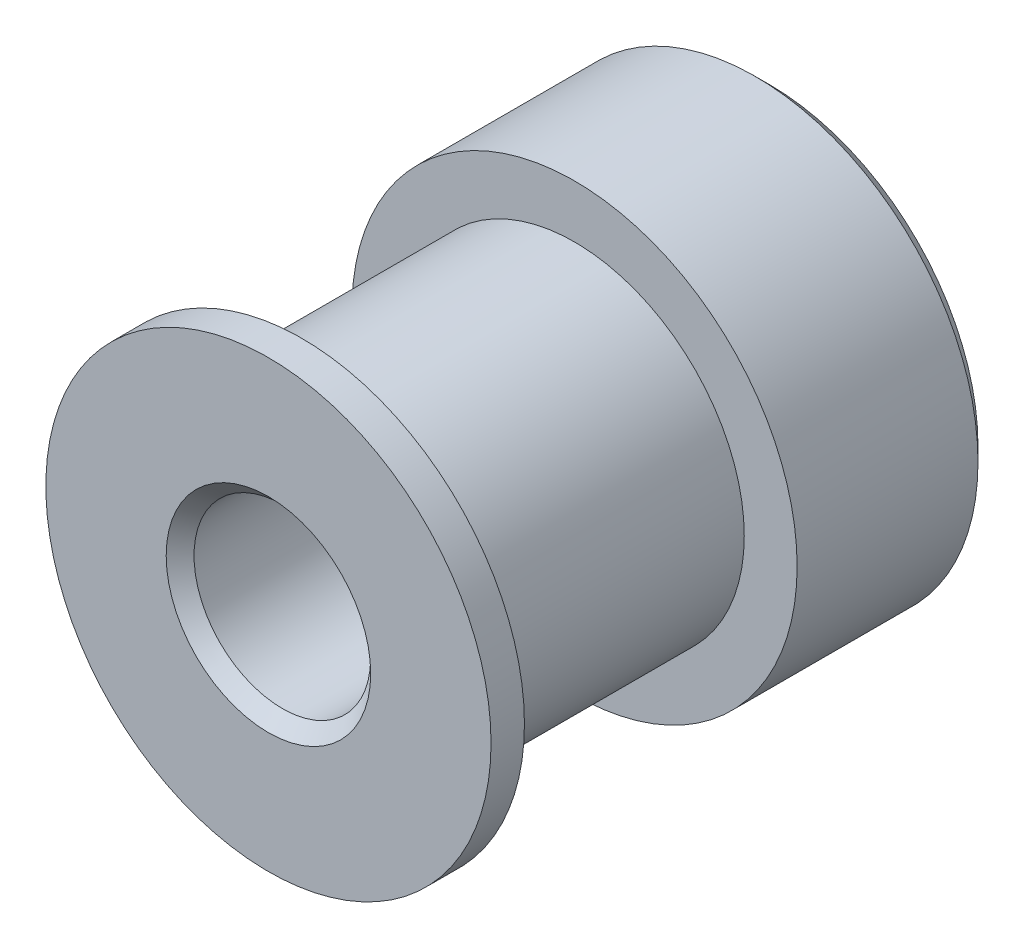
ISO-10303-21;
HEADER;
FILE_DESCRIPTION(('STEP AP214'),'2;1');
FILE_NAME('part.step','',(''),(''),'','','');
FILE_SCHEMA(('AUTOMOTIVE_DESIGN { 1 0 10303 214 1 1 1 1 }'));
ENDSEC;
DATA;
#1=APPLICATION_CONTEXT('core data for automotive mechanical design processes');
#2=APPLICATION_PROTOCOL_DEFINITION('international standard','automotive_design',2000,#1);
#3=PRODUCT_CONTEXT('',#1,'mechanical');
#4=PRODUCT('Part','Part','',(#3));
#5=PRODUCT_RELATED_PRODUCT_CATEGORY('part','',(#4));
#6=PRODUCT_DEFINITION_FORMATION('','',#4);
#7=PRODUCT_DEFINITION_CONTEXT('part definition',#1,'design');
#8=PRODUCT_DEFINITION('design','',#6,#7);
#9=PRODUCT_DEFINITION_SHAPE('','',#8);
#10=(LENGTH_UNIT() NAMED_UNIT(*) SI_UNIT(.MILLI.,.METRE.));
#11=(NAMED_UNIT(*) PLANE_ANGLE_UNIT() SI_UNIT($,.RADIAN.));
#12=(NAMED_UNIT(*) SI_UNIT($,.STERADIAN.) SOLID_ANGLE_UNIT());
#13=UNCERTAINTY_MEASURE_WITH_UNIT(LENGTH_MEASURE(1.E-05),#10,'distance_accuracy_value','');
#14=(GEOMETRIC_REPRESENTATION_CONTEXT(3) GLOBAL_UNCERTAINTY_ASSIGNED_CONTEXT((#13)) GLOBAL_UNIT_ASSIGNED_CONTEXT((#10,
#11,#12)) REPRESENTATION_CONTEXT('',''));
#15=CARTESIAN_POINT('',(0.,0.,0.));
#16=DIRECTION('',(0.,0.,1.));
#17=DIRECTION('',(1.,0.,0.));
#18=AXIS2_PLACEMENT_3D('',#15,#16,#17);
#19=CARTESIAN_POINT('',(0.,0.,7.));
#20=DIRECTION('',(0.,0.,1.));
#21=DIRECTION('',(1.,0.,0.));
#22=AXIS2_PLACEMENT_3D('',#19,#20,#21);
#23=PLANE('',#22);
#24=CARTESIAN_POINT('',(0.,0.,7.));
#25=DIRECTION('',(0.,0.,1.));
#26=DIRECTION('',(1.,0.,0.));
#27=AXIS2_PLACEMENT_3D('',#24,#25,#26);
#28=CIRCLE('',#27,8.);
#29=CARTESIAN_POINT('',(8.,0.,7.));
#30=VERTEX_POINT('',#29);
#31=EDGE_CURVE('E140',#30,#30,#28,.T.);
#32=ORIENTED_EDGE('',*,*,#31,.T.);
#33=EDGE_LOOP('',(#32));
#34=FACE_BOUND('',#33,.T.);
#35=CARTESIAN_POINT('',(0.,0.,7.));
#36=DIRECTION('',(0.,0.,1.));
#37=DIRECTION('',(1.,0.,0.));
#38=AXIS2_PLACEMENT_3D('',#35,#36,#37);
#39=CIRCLE('',#38,6.1);
#40=CARTESIAN_POINT('',(6.1,0.,7.));
#41=VERTEX_POINT('',#40);
#42=EDGE_CURVE('E131',#41,#41,#39,.T.);
#43=ORIENTED_EDGE('',*,*,#42,.F.);
#44=EDGE_LOOP('',(#43));
#45=FACE_BOUND('',#44,.T.);
#46=ADVANCED_FACE('F31',(#34,#45),#23,.T.);
#47=CARTESIAN_POINT('',(0.,0.,7.));
#48=DIRECTION('',(0.,0.,-1.));
#49=DIRECTION('',(-1.,0.,0.));
#50=AXIS2_PLACEMENT_3D('',#47,#48,#49);
#51=CYLINDRICAL_SURFACE('',#50,8.);
#52=CARTESIAN_POINT('',(0.,-8.,5.));
#53=CARTESIAN_POINT('',(0.0834717464654712,-7.99999848833852,4.99999681041172));
#54=CARTESIAN_POINT('',(0.166984992730099,-7.99868009921714,4.99300892338062));
#55=CARTESIAN_POINT('',(0.331658129841798,-7.9935478589052,4.96526000488165));
#56=CARTESIAN_POINT('',(0.412815974152226,-7.98973190166897,4.94448734936027));
#57=CARTESIAN_POINT('',(0.570372961851801,-7.98003138765458,4.88982729874066));
#58=CARTESIAN_POINT('',(0.646776330685344,-7.97414869946483,4.85595174754746));
#59=CARTESIAN_POINT('',(0.792807973094006,-7.96095710599783,4.77608112307718));
#60=CARTESIAN_POINT('',(0.862436794477323,-7.9536483161829,4.73008703085518));
#61=CARTESIAN_POINT('',(0.993783715930503,-7.93831336430504,4.62670023199632));
#62=CARTESIAN_POINT('',(1.05540895503183,-7.93028034856351,4.56919055532986));
#63=CARTESIAN_POINT('',(1.16819606135369,-7.9144531845865,4.44465669091244));
#64=CARTESIAN_POINT('',(1.21935717689242,-7.90665905354527,4.37763182023071));
#65=CARTESIAN_POINT('',(1.31014998665793,-7.89212551245005,4.23531391163603));
#66=CARTESIAN_POINT('',(1.34968721969605,-7.88539493886182,4.15995962968276));
#67=CARTESIAN_POINT('',(1.41550524332283,-7.87384713211987,4.00353108482321));
#68=CARTESIAN_POINT('',(1.44178717713098,-7.86902973396962,3.92245731588878));
#69=CARTESIAN_POINT('',(1.480050535035,-7.8619226957455,3.75788476908559));
#70=CARTESIAN_POINT('',(1.49219390192039,-7.85960445366405,3.67442490279654));
#71=CARTESIAN_POINT('',(1.50233808095346,-7.85767197152761,3.50662261519175));
#72=CARTESIAN_POINT('',(1.50034016135374,-7.8580574889876,3.4222802736977));
#73=CARTESIAN_POINT('',(1.48238979602362,-7.86146292701753,3.25628047473395));
#74=CARTESIAN_POINT('',(1.46662149996045,-7.86444808147334,3.17460228569985));
#75=CARTESIAN_POINT('',(1.42186799396207,-7.87266183284666,3.01507158021739));
#76=CARTESIAN_POINT('',(1.39288222239499,-7.87789052509516,2.9372192264907));
#77=CARTESIAN_POINT('',(1.322336471793,-7.89003855292589,2.78701132099974));
#78=CARTESIAN_POINT('',(1.28070213532456,-7.89696783823366,2.71469152941919));
#79=CARTESIAN_POINT('',(1.18609368930416,-7.91172971602918,2.57799527145977));
#80=CARTESIAN_POINT('',(1.13311842889266,-7.91956240015522,2.5136196122852));
#81=CARTESIAN_POINT('',(1.01633905685298,-7.93540001272164,2.39357504432754));
#82=CARTESIAN_POINT('',(0.952377436860683,-7.94340571024031,2.33805934754826));
#83=CARTESIAN_POINT('',(0.815968037098827,-7.95857386108318,2.2385227593246));
#84=CARTESIAN_POINT('',(0.74352017225577,-7.96573630595245,2.19450198312958));
#85=CARTESIAN_POINT('',(0.592034988874669,-7.97842539677509,2.11918224612998));
#86=CARTESIAN_POINT('',(0.512989564446494,-7.98394999136289,2.08789922088211));
#87=CARTESIAN_POINT('',(0.350639115398697,-7.99272505402719,2.03909790690784));
#88=CARTESIAN_POINT('',(0.267334544277787,-7.99597576367994,2.02157815595464));
#89=CARTESIAN_POINT('',(0.100148652903385,-7.99980360641981,2.00101396898173));
#90=CARTESIAN_POINT('',(0.0162940126341354,-8.00041950912279,1.99775960847027));
#91=CARTESIAN_POINT('',(-0.150761248092184,-7.99901543598228,2.00525547954765));
#92=CARTESIAN_POINT('',(-0.233961900480385,-7.99699558964431,2.01600502306526));
#93=CARTESIAN_POINT('',(-0.396681573218216,-7.99057111500406,2.05102903518337));
#94=CARTESIAN_POINT('',(-0.476224261046062,-7.98618522374031,2.07519728253781));
#95=CARTESIAN_POINT('',(-0.630128631824632,-7.97551842212498,2.13625770677879));
#96=CARTESIAN_POINT('',(-0.704489962595102,-7.96923738311334,2.17315074756579));
#97=CARTESIAN_POINT('',(-0.846816671513213,-7.95538030357666,2.25907812815951));
#98=CARTESIAN_POINT('',(-0.91470327701512,-7.94779086174563,2.30824073853684));
#99=CARTESIAN_POINT('',(-1.04133832326454,-7.93219343489712,2.41713813736236));
#100=CARTESIAN_POINT('',(-1.10008590976087,-7.92418541084687,2.47687391300133));
#101=CARTESIAN_POINT('',(-1.20757295872048,-7.9085247569745,2.60617231891143));
#102=CARTESIAN_POINT('',(-1.25616916218577,-7.90087825860257,2.67585490812539));
#103=CARTESIAN_POINT('',(-1.34096675057787,-7.88692985578532,2.82251762452375));
#104=CARTESIAN_POINT('',(-1.37716859613924,-7.8806279013735,2.89949748037047));
#105=CARTESIAN_POINT('',(-1.43594673512823,-7.87013024209574,3.05820586724254));
#106=CARTESIAN_POINT('',(-1.45858868794786,-7.86592440436878,3.13990937955933));
#107=CARTESIAN_POINT('',(-1.48980679326235,-7.86007203802415,3.3060472225214));
#108=CARTESIAN_POINT('',(-1.49838453270708,-7.8584252206579,3.3904812439704));
#109=CARTESIAN_POINT('',(-1.50117762148355,-7.85789199803857,3.55824833144151));
#110=CARTESIAN_POINT('',(-1.49561895003499,-7.85896215974293,3.641577580957));
#111=CARTESIAN_POINT('',(-1.47079175378803,-7.86364600659998,3.80609142204529));
#112=CARTESIAN_POINT('',(-1.45152331089332,-7.86725967655747,3.88727602642744));
#113=CARTESIAN_POINT('',(-1.39991887583263,-7.8766050802318,4.04507448479548));
#114=CARTESIAN_POINT('',(-1.36760735397252,-7.88233284594965,4.12169659134577));
#115=CARTESIAN_POINT('',(-1.29085868912204,-7.8952638755184,4.26846825424084));
#116=CARTESIAN_POINT('',(-1.24642068948186,-7.90246724360119,4.33861735284478));
#117=CARTESIAN_POINT('',(-1.14589487339535,-7.91767266107745,4.47158368004229));
#118=CARTESIAN_POINT('',(-1.08964259864303,-7.92568505353043,4.5342754125671));
#119=CARTESIAN_POINT('',(-0.967427926742291,-7.94152833918735,4.64940516246452));
#120=CARTESIAN_POINT('',(-0.901463301891616,-7.94935919027328,4.70184082098014));
#121=CARTESIAN_POINT('',(-0.760984945071873,-7.96403975968049,4.79541095262706));
#122=CARTESIAN_POINT('',(-0.686399590640517,-7.97088000990561,4.83643942849064));
#123=CARTESIAN_POINT('',(-0.531290113653834,-7.98271619380687,4.90531763660513));
#124=CARTESIAN_POINT('',(-0.450771651705248,-7.98771385879037,4.93317974704691));
#125=CARTESIAN_POINT('',(-0.308347202825154,-7.99428290707632,4.96927731441867));
#126=CARTESIAN_POINT('',(-0.24727381025187,-7.99641470878206,4.9807786303128));
#127=CARTESIAN_POINT('',(-0.124141247115157,-7.9992737995401,4.99614106211645));
#128=CARTESIAN_POINT('',(-0.0620821016527089,-8.00000112429805,5.00000237225591));
#129=CARTESIAN_POINT('',(0.,-8.,5.));
#130=B_SPLINE_CURVE_WITH_KNOTS('',3,(#52,#53,#54,#55,#56,#57,#58,#59,#60,#61,#62,#63,#64,#65,
#66,#67,#68,#69,#70,#71,#72,#73,#74,#75,#76,#77,#78,#79,#80,#81,#82,#83,#84,#85,#86,#87,#88,#89,
#90,#91,#92,#93,#94,#95,#96,#97,#98,#99,#100,#101,#102,#103,#104,#105,#106,#107,#108,#109,#110,
#111,#112,#113,#114,#115,#116,#117,#118,#119,#120,#121,#122,#123,#124,#125,#126,#127,#128,#129),
.UNSPECIFIED.,.T.,.F.,(4,2,2,2,2,2,2,2,2,2,2,2,2,2,2,2,2,2,2,2,2,2,2,2,2,2,2,2,2,2,2,2,2,2,2,2,
2,2,4),(0.,0.250188200964924,0.500587642535452,0.750761271230907,1.00091465336891,
1.2537511801363,1.50660586283617,1.76146190504358,2.01629596311948,2.26818151445336,
2.52004447587256,2.76859000612766,3.01714609846787,3.26719262629531,3.51726454049859,
3.77127768464077,4.02529337544948,4.27962588321699,4.53393136673745,4.78448174076097,
5.03501980464583,5.28360233907828,5.53220175338032,5.78351778017708,6.03485728413098,
6.28953436987299,6.54420198954945,6.79762627818559,7.05102196946513,7.30039252231748,
7.54976158541507,7.79866496207692,8.04758592655423,8.3002336996638,8.55293951262255,
8.80792048916314,9.06266126931173,9.24874344524409,9.4348208903954),.UNSPECIFIED.);
#131=CARTESIAN_POINT('',(0.,-8.,5.));
#132=VERTEX_POINT('',#131);
#133=EDGE_CURVE('E57',#132,#132,#130,.T.);
#134=ORIENTED_EDGE('',*,*,#133,.T.);
#135=EDGE_LOOP('',(#134));
#136=FACE_BOUND('',#135,.T.);
#137=CARTESIAN_POINT('',(-8.,0.,2.));
#138=CARTESIAN_POINT('',(-7.99999848833852,0.0834717464654704,2.00000318958828));
#139=CARTESIAN_POINT('',(-7.99868009921714,0.166984992730098,2.00699107661938));
#140=CARTESIAN_POINT('',(-7.9935478589052,0.331658129841797,2.03473999511835));
#141=CARTESIAN_POINT('',(-7.98973190166897,0.412815974152225,2.05551265063973));
#142=CARTESIAN_POINT('',(-7.98003138765458,0.570372961851801,2.11017270125934));
#143=CARTESIAN_POINT('',(-7.97414869946483,0.646776330685343,2.14404825245254));
#144=CARTESIAN_POINT('',(-7.96095710599783,0.792807973094006,2.22391887692282));
#145=CARTESIAN_POINT('',(-7.9536483161829,0.862436794477322,2.26991296914482));
#146=CARTESIAN_POINT('',(-7.93831336430504,0.993783715930502,2.37329976800368));
#147=CARTESIAN_POINT('',(-7.93028034856351,1.05540895503183,2.43080944467014));
#148=CARTESIAN_POINT('',(-7.9144531845865,1.16819606135369,2.55534330908756));
#149=CARTESIAN_POINT('',(-7.90665905354527,1.21935717689241,2.62236817976929));
#150=CARTESIAN_POINT('',(-7.89212551245005,1.31014998665793,2.76468608836397));
#151=CARTESIAN_POINT('',(-7.88539493886182,1.34968721969605,2.84004037031724));
#152=CARTESIAN_POINT('',(-7.87384713211987,1.41550524332283,2.99646891517679));
#153=CARTESIAN_POINT('',(-7.86902973396962,1.44178717713098,3.07754268411122));
#154=CARTESIAN_POINT('',(-7.8619226957455,1.480050535035,3.24211523091441));
#155=CARTESIAN_POINT('',(-7.85960445366405,1.49219390192039,3.32557509720346));
#156=CARTESIAN_POINT('',(-7.85767197152761,1.50233808095346,3.49337738480825));
#157=CARTESIAN_POINT('',(-7.8580574889876,1.50034016135374,3.5777197263023));
#158=CARTESIAN_POINT('',(-7.86146292701753,1.48238979602362,3.74371952526605));
#159=CARTESIAN_POINT('',(-7.86444808147334,1.46662149996045,3.82539771430015));
#160=CARTESIAN_POINT('',(-7.87266183284666,1.42186799396207,3.98492841978261));
#161=CARTESIAN_POINT('',(-7.87789052509516,1.39288222239499,4.0627807735093));
#162=CARTESIAN_POINT('',(-7.89003855292589,1.322336471793,4.21298867900026));
#163=CARTESIAN_POINT('',(-7.89696783823366,1.28070213532456,4.28530847058081));
#164=CARTESIAN_POINT('',(-7.91172971602918,1.18609368930416,4.42200472854023));
#165=CARTESIAN_POINT('',(-7.91956240015522,1.13311842889266,4.4863803877148));
#166=CARTESIAN_POINT('',(-7.93540001272164,1.01633905685298,4.60642495567246));
#167=CARTESIAN_POINT('',(-7.9434057102403,0.952377436860682,4.66194065245174));
#168=CARTESIAN_POINT('',(-7.95857386108318,0.815968037098826,4.76147724067541));
#169=CARTESIAN_POINT('',(-7.96573630595245,0.743520172255769,4.80549801687042));
#170=CARTESIAN_POINT('',(-7.97842539677509,0.592034988874667,4.88081775387002));
#171=CARTESIAN_POINT('',(-7.98394999136289,0.512989564446493,4.9121007791179));
#172=CARTESIAN_POINT('',(-7.99272505402719,0.350639115398696,4.96090209309216));
#173=CARTESIAN_POINT('',(-7.99597576367994,0.267334544277786,4.97842184404536));
#174=CARTESIAN_POINT('',(-7.99980360641981,0.100148652903385,4.99898603101827));
#175=CARTESIAN_POINT('',(-8.00041950912279,0.0162940126341347,5.00224039152973));
#176=CARTESIAN_POINT('',(-7.99901543598228,-0.150761248092184,4.99474452045235));
#177=CARTESIAN_POINT('',(-7.99699558964431,-0.233961900480386,4.98399497693474));
#178=CARTESIAN_POINT('',(-7.99057111500406,-0.396681573218218,4.94897096481663));
#179=CARTESIAN_POINT('',(-7.98618522374031,-0.476224261046064,4.92480271746219));
#180=CARTESIAN_POINT('',(-7.97551842212498,-0.630128631824633,4.86374229322121));
#181=CARTESIAN_POINT('',(-7.96923738311334,-0.704489962595103,4.82684925243421));
#182=CARTESIAN_POINT('',(-7.95538030357666,-0.846816671513214,4.74092187184049));
#183=CARTESIAN_POINT('',(-7.94779086174563,-0.914703277015122,4.69175926146316));
#184=CARTESIAN_POINT('',(-7.93219343489712,-1.04133832326455,4.58286186263764));
#185=CARTESIAN_POINT('',(-7.92418541084687,-1.10008590976087,4.52312608699867));
#186=CARTESIAN_POINT('',(-7.9085247569745,-1.20757295872048,4.39382768108857));
#187=CARTESIAN_POINT('',(-7.90087825860257,-1.25616916218577,4.32414509187461));
#188=CARTESIAN_POINT('',(-7.88692985578532,-1.34096675057787,4.17748237547625));
#189=CARTESIAN_POINT('',(-7.8806279013735,-1.37716859613924,4.10050251962953));
#190=CARTESIAN_POINT('',(-7.87013024209574,-1.43594673512823,3.94179413275746));
#191=CARTESIAN_POINT('',(-7.86592440436878,-1.45858868794786,3.86009062044067));
#192=CARTESIAN_POINT('',(-7.86007203802415,-1.48980679326236,3.6939527774786));
#193=CARTESIAN_POINT('',(-7.8584252206579,-1.49838453270708,3.6095187560296));
#194=CARTESIAN_POINT('',(-7.85789199803857,-1.50117762148355,3.44175166855849));
#195=CARTESIAN_POINT('',(-7.85896215974293,-1.49561895003499,3.358422419043));
#196=CARTESIAN_POINT('',(-7.86364600659998,-1.47079175378803,3.19390857795471));
#197=CARTESIAN_POINT('',(-7.86725967655747,-1.45152331089332,3.11272397357256));
#198=CARTESIAN_POINT('',(-7.8766050802318,-1.39991887583263,2.95492551520452));
#199=CARTESIAN_POINT('',(-7.88233284594965,-1.36760735397252,2.87830340865423));
#200=CARTESIAN_POINT('',(-7.8952638755184,-1.29085868912204,2.73153174575916));
#201=CARTESIAN_POINT('',(-7.90246724360119,-1.24642068948186,2.66138264715522));
#202=CARTESIAN_POINT('',(-7.91767266107745,-1.14589487339535,2.52841631995771));
#203=CARTESIAN_POINT('',(-7.92568505353043,-1.08964259864304,2.4657245874329));
#204=CARTESIAN_POINT('',(-7.94152833918735,-0.967427926742291,2.35059483753548));
#205=CARTESIAN_POINT('',(-7.94935919027328,-0.901463301891616,2.29815917901986));
#206=CARTESIAN_POINT('',(-7.96403975968049,-0.760984945071873,2.20458904737294));
#207=CARTESIAN_POINT('',(-7.97088000990561,-0.686399590640517,2.16356057150936));
#208=CARTESIAN_POINT('',(-7.98271619380687,-0.531290113653835,2.09468236339487));
#209=CARTESIAN_POINT('',(-7.98771385879037,-0.450771651705249,2.06682025295309));
#210=CARTESIAN_POINT('',(-7.99428290707632,-0.308347202825155,2.03072268558133));
#211=CARTESIAN_POINT('',(-7.99641470878206,-0.247273810251872,2.0192213696872));
#212=CARTESIAN_POINT('',(-7.9992737995401,-0.124141247115159,2.00385893788355));
#213=CARTESIAN_POINT('',(-8.00000112429805,-0.0620821016527104,1.99999762774409));
#214=CARTESIAN_POINT('',(-8.,0.,2.));
#215=B_SPLINE_CURVE_WITH_KNOTS('',3,(#137,#138,#139,#140,#141,#142,#143,#144,#145,#146,#147,
#148,#149,#150,#151,#152,#153,#154,#155,#156,#157,#158,#159,#160,#161,#162,#163,#164,#165,#166,
#167,#168,#169,#170,#171,#172,#173,#174,#175,#176,#177,#178,#179,#180,#181,#182,#183,#184,#185,
#186,#187,#188,#189,#190,#191,#192,#193,#194,#195,#196,#197,#198,#199,#200,#201,#202,#203,#204,
#205,#206,#207,#208,#209,#210,#211,#212,#213,#214),.UNSPECIFIED.,.T.,.F.,(4,2,2,2,2,2,2,2,2,2,2,
2,2,2,2,2,2,2,2,2,2,2,2,2,2,2,2,2,2,2,2,2,2,2,2,2,2,2,4),(0.,0.250188200964924,
0.500587642535452,0.750761271230907,1.00091465336891,1.2537511801363,1.50660586283617,
1.76146190504357,2.01629596311948,2.26818151445336,2.52004447587256,2.76859000612765,
3.01714609846786,3.26719262629531,3.51726454049859,3.77127768464077,4.02529337544948,
4.27962588321699,4.53393136673745,4.78448174076097,5.03501980464584,5.28360233907828,
5.53220175338032,5.78351778017708,6.03485728413098,6.28953436987299,6.54420198954945,
6.79762627818559,7.05102196946513,7.30039252231748,7.54976158541507,7.79866496207693,
8.04758592655423,8.3002336996638,8.55293951262256,8.80792048916315,9.06266126931173,
9.24874344524409,9.43482089039541),.UNSPECIFIED.);
#216=CARTESIAN_POINT('',(-8.,0.,2.));
#217=VERTEX_POINT('',#216);
#218=EDGE_CURVE('E56',#217,#217,#215,.T.);
#219=ORIENTED_EDGE('',*,*,#218,.T.);
#220=EDGE_LOOP('',(#219));
#221=FACE_BOUND('',#220,.T.);
#222=CARTESIAN_POINT('',(0.,0.,0.5));
#223=DIRECTION('',(0.,0.,1.));
#224=DIRECTION('',(1.,0.,0.));
#225=AXIS2_PLACEMENT_3D('',#222,#223,#224);
#226=CIRCLE('',#225,8.);
#227=CARTESIAN_POINT('',(8.,0.,0.5));
#228=VERTEX_POINT('',#227);
#229=EDGE_CURVE('E143',#228,#228,#226,.T.);
#230=ORIENTED_EDGE('',*,*,#229,.T.);
#231=EDGE_LOOP('',(#230));
#232=FACE_BOUND('',#231,.T.);
#233=ORIENTED_EDGE('',*,*,#31,.F.);
#234=EDGE_LOOP('',(#233));
#235=FACE_BOUND('',#234,.T.);
#236=ADVANCED_FACE('F80',(#136,#221,#232,#235),#51,.T.);
#237=CARTESIAN_POINT('',(0.,0.,0.));
#238=DIRECTION('',(0.,0.,1.));
#239=DIRECTION('',(1.,0.,0.));
#240=AXIS2_PLACEMENT_3D('',#237,#238,#239);
#241=PLANE('',#240);
#242=CARTESIAN_POINT('',(0.,0.,0.));
#243=DIRECTION('',(0.,0.,1.));
#244=DIRECTION('',(1.,0.,0.));
#245=AXIS2_PLACEMENT_3D('',#242,#243,#244);
#246=CIRCLE('',#245,7.5);
#247=CARTESIAN_POINT('',(7.5,0.,0.));
#248=VERTEX_POINT('',#247);
#249=EDGE_CURVE('E149',#248,#248,#246,.F.);
#250=ORIENTED_EDGE('',*,*,#249,.T.);
#251=EDGE_LOOP('',(#250));
#252=FACE_BOUND('',#251,.T.);
#253=CARTESIAN_POINT('',(0.,0.,0.));
#254=DIRECTION('',(0.,0.,1.));
#255=DIRECTION('',(1.,0.,0.));
#256=AXIS2_PLACEMENT_3D('',#253,#254,#255);
#257=CIRCLE('',#256,3.675);
#258=CARTESIAN_POINT('',(3.675,0.,0.));
#259=VERTEX_POINT('',#258);
#260=EDGE_CURVE('E146',#259,#259,#257,.T.);
#261=ORIENTED_EDGE('',*,*,#260,.T.);
#262=EDGE_LOOP('',(#261));
#263=FACE_BOUND('',#262,.T.);
#264=ADVANCED_FACE('F85',(#252,#263),#241,.F.);
#265=CARTESIAN_POINT('',(0.,0.,16.8));
#266=DIRECTION('',(0.,0.,-1.));
#267=DIRECTION('',(-1.,0.,0.));
#268=AXIS2_PLACEMENT_3D('',#265,#266,#267);
#269=CYLINDRICAL_SURFACE('',#268,6.1);
#270=CARTESIAN_POINT('',(0.,0.,16.8));
#271=DIRECTION('',(0.,0.,1.));
#272=DIRECTION('',(1.,0.,0.));
#273=AXIS2_PLACEMENT_3D('',#270,#271,#272);
#274=CIRCLE('',#273,6.1);
#275=CARTESIAN_POINT('',(6.1,0.,16.8));
#276=VERTEX_POINT('',#275);
#277=EDGE_CURVE('E133',#276,#276,#274,.T.);
#278=ORIENTED_EDGE('',*,*,#277,.F.);
#279=EDGE_LOOP('',(#278));
#280=FACE_BOUND('',#279,.T.);
#281=ORIENTED_EDGE('',*,*,#42,.T.);
#282=EDGE_LOOP('',(#281));
#283=FACE_BOUND('',#282,.T.);
#284=ADVANCED_FACE('F109',(#280,#283),#269,.T.);
#285=CARTESIAN_POINT('',(0.,0.,16.8));
#286=DIRECTION('',(0.,0.,1.));
#287=DIRECTION('',(1.,0.,0.));
#288=AXIS2_PLACEMENT_3D('',#285,#286,#287);
#289=PLANE('',#288);
#290=CARTESIAN_POINT('',(0.,0.,16.8));
#291=DIRECTION('',(0.,0.,1.));
#292=DIRECTION('',(1.,0.,0.));
#293=AXIS2_PLACEMENT_3D('',#290,#291,#292);
#294=CIRCLE('',#293,8.);
#295=CARTESIAN_POINT('',(8.,0.,16.8));
#296=VERTEX_POINT('',#295);
#297=EDGE_CURVE('E75',#296,#296,#294,.T.);
#298=ORIENTED_EDGE('',*,*,#297,.F.);
#299=EDGE_LOOP('',(#298));
#300=FACE_BOUND('',#299,.T.);
#301=ORIENTED_EDGE('',*,*,#277,.T.);
#302=EDGE_LOOP('',(#301));
#303=FACE_BOUND('',#302,.T.);
#304=ADVANCED_FACE('F112',(#300,#303),#289,.F.);
#305=CARTESIAN_POINT('',(0.,0.,18.));
#306=DIRECTION('',(0.,0.,-1.));
#307=DIRECTION('',(-1.,0.,0.));
#308=AXIS2_PLACEMENT_3D('',#305,#306,#307);
#309=CYLINDRICAL_SURFACE('',#308,8.);
#310=CARTESIAN_POINT('',(0.,0.,18.));
#311=DIRECTION('',(0.,0.,1.));
#312=DIRECTION('',(1.,0.,0.));
#313=AXIS2_PLACEMENT_3D('',#310,#311,#312);
#314=CIRCLE('',#313,8.);
#315=CARTESIAN_POINT('',(8.,0.,18.));
#316=VERTEX_POINT('',#315);
#317=EDGE_CURVE('E78',#316,#316,#314,.T.);
#318=ORIENTED_EDGE('',*,*,#317,.F.);
#319=EDGE_LOOP('',(#318));
#320=FACE_BOUND('',#319,.T.);
#321=ORIENTED_EDGE('',*,*,#297,.T.);
#322=EDGE_LOOP('',(#321));
#323=FACE_BOUND('',#322,.T.);
#324=ADVANCED_FACE('F114',(#320,#323),#309,.T.);
#325=CARTESIAN_POINT('',(0.,0.,18.));
#326=DIRECTION('',(0.,0.,1.));
#327=DIRECTION('',(1.,0.,0.));
#328=AXIS2_PLACEMENT_3D('',#325,#326,#327);
#329=PLANE('',#328);
#330=CARTESIAN_POINT('',(0.,0.,18.));
#331=DIRECTION('',(0.,0.,1.));
#332=DIRECTION('',(1.,0.,0.));
#333=AXIS2_PLACEMENT_3D('',#330,#331,#332);
#334=CIRCLE('',#333,3.675);
#335=CARTESIAN_POINT('',(3.675,0.,18.));
#336=VERTEX_POINT('',#335);
#337=EDGE_CURVE('E10',#336,#336,#334,.F.);
#338=ORIENTED_EDGE('',*,*,#337,.T.);
#339=EDGE_LOOP('',(#338));
#340=FACE_BOUND('',#339,.T.);
#341=ORIENTED_EDGE('',*,*,#317,.T.);
#342=EDGE_LOOP('',(#341));
#343=FACE_BOUND('',#342,.T.);
#344=ADVANCED_FACE('F117',(#340,#343),#329,.T.);
#345=CARTESIAN_POINT('',(0.,0.,0.));
#346=DIRECTION('',(0.,0.,1.));
#347=DIRECTION('',(1.,0.,0.));
#348=AXIS2_PLACEMENT_3D('',#345,#346,#347);
#349=CYLINDRICAL_SURFACE('',#348,3.175);
#350=CARTESIAN_POINT('',(0.,-3.175,5.));
#351=CARTESIAN_POINT('',(-0.0793696056331873,-3.17499621985294,4.99999552610351));
#352=CARTESIAN_POINT('',(-0.158848966213319,-3.17199120370814,4.99366335348419));
#353=CARTESIAN_POINT('',(-0.315490796657699,-3.16026762742416,4.9685996128575));
#354=CARTESIAN_POINT('',(-0.392647876041672,-3.15153670753249,4.94984122112576));
#355=CARTESIAN_POINT('',(-0.542134614016449,-3.1292818514019,4.90080463386028));
#356=CARTESIAN_POINT('',(-0.614481134826973,-3.11577583396693,4.87056947468804));
#357=CARTESIAN_POINT('',(-0.752982757479879,-3.08523557557938,4.79964446831745));
#358=CARTESIAN_POINT('',(-0.819138798737004,-3.06820187122341,4.75895621091422));
#359=CARTESIAN_POINT('',(-0.947531977551391,-3.03109215002452,4.66568662754687));
#360=CARTESIAN_POINT('',(-1.00934531536298,-3.01089949607389,4.61256891765261));
#361=CARTESIAN_POINT('',(-1.12356872804671,-2.97016877751052,4.49709401541806));
#362=CARTESIAN_POINT('',(-1.17597245123061,-2.94963048974006,4.43473063351147));
#363=CARTESIAN_POINT('',(-1.27340721108708,-2.90895734211161,4.29748436454971));
#364=CARTESIAN_POINT('',(-1.31770529611402,-2.88894252906622,4.22204154314483));
#365=CARTESIAN_POINT('',(-1.39279860497067,-2.85350194913633,4.06371450605077));
#366=CARTESIAN_POINT('',(-1.4236026358555,-2.83807319122874,3.98083518657092));
#367=CARTESIAN_POINT('',(-1.46896762087975,-2.81484981523147,3.81481732997647));
#368=CARTESIAN_POINT('',(-1.48434942407678,-2.80667245171199,3.73195910458647));
#369=CARTESIAN_POINT('',(-1.50096994970779,-2.79782290647243,3.56446669966953));
#370=CARTESIAN_POINT('',(-1.5022201551264,-2.79714463118969,3.47983401805994));
#371=CARTESIAN_POINT('',(-1.49114871052963,-2.80305593263808,3.32062469140227));
#372=CARTESIAN_POINT('',(-1.48022366031689,-2.80889771224103,3.24591684055566));
#373=CARTESIAN_POINT('',(-1.44750469243097,-2.82589657910714,3.09955531913525));
#374=CARTESIAN_POINT('',(-1.42570787921159,-2.83705508237193,3.02790246774061));
#375=CARTESIAN_POINT('',(-1.37144042107045,-2.86368711079333,2.88767854274785));
#376=CARTESIAN_POINT('',(-1.33873421633754,-2.87925460442575,2.8192173067294));
#377=CARTESIAN_POINT('',(-1.26375034917989,-2.91294481240157,2.68844422930819));
#378=CARTESIAN_POINT('',(-1.22146847336964,-2.93106865023239,2.62613511227864));
#379=CARTESIAN_POINT('',(-1.12301829304094,-2.97027967308475,2.50211398210142));
#380=CARTESIAN_POINT('',(-1.06582685913966,-2.99147184174414,2.44124465826451));
#381=CARTESIAN_POINT('',(-0.941911654521738,-3.03276969244737,2.32963307898786));
#382=CARTESIAN_POINT('',(-0.875184240523147,-3.05287495516681,2.27889471198725));
#383=CARTESIAN_POINT('',(-0.730900451942525,-3.09065813188422,2.18723446950541));
#384=CARTESIAN_POINT('',(-0.653032764749389,-3.10821737934191,2.1467498749094));
#385=CARTESIAN_POINT('',(-0.490549806409963,-3.13795896561378,2.07976514725872));
#386=CARTESIAN_POINT('',(-0.405939389394615,-3.15014513198241,2.05325505672055));
#387=CARTESIAN_POINT('',(-0.239325331183662,-3.16698849385516,2.01695327830054));
#388=CARTESIAN_POINT('',(-0.157618085372369,-3.17215069636453,2.00603697774867));
#389=CARTESIAN_POINT('',(0.00662006237334169,-3.17605374308904,1.99776549827472));
#390=CARTESIAN_POINT('',(0.0891506200914331,-3.17479716715133,2.00040487103399));
#391=CARTESIAN_POINT('',(0.246790904756255,-3.16631250425399,2.01845895022593));
#392=CARTESIAN_POINT('',(0.322025617263289,-3.15949303898597,2.03299968212115));
#393=CARTESIAN_POINT('',(0.468859911387633,-3.14106249856194,2.07312746629384));
#394=CARTESIAN_POINT('',(0.540459070755479,-3.12945086824544,2.09871579842438));
#395=CARTESIAN_POINT('',(0.680482664613306,-3.10206629000487,2.16097277598054));
#396=CARTESIAN_POINT('',(0.748744433690326,-3.0861775760538,2.19795459585581));
#397=CARTESIAN_POINT('',(0.878333413113474,-3.05182842645659,2.28160542554883));
#398=CARTESIAN_POINT('',(0.939657562453442,-3.0333668635778,2.32827868585652));
#399=CARTESIAN_POINT('',(1.05944471500475,-2.99374847615918,2.43484016430619));
#400=CARTESIAN_POINT('',(1.11715821701519,-2.97249840501299,2.49553803008255));
#401=CARTESIAN_POINT('',(1.22187582163969,-2.9310107026401,2.6259200433733));
#402=CARTESIAN_POINT('',(1.26887443843489,-2.91077359415055,2.69560876557418));
#403=CARTESIAN_POINT('',(1.35231773600021,-2.87298422238289,2.84515860569975));
#404=CARTESIAN_POINT('',(1.3883357483136,-2.85555063245793,2.92529027685059));
#405=CARTESIAN_POINT('',(1.44599796651068,-2.82679504093384,3.09157573608092));
#406=CARTESIAN_POINT('',(1.46765854978947,-2.81546607860886,3.17772253828127));
#407=CARTESIAN_POINT('',(1.49416555358527,-2.80148148307169,3.34513659709301));
#408=CARTESIAN_POINT('',(1.50036748851185,-2.79812792823292,3.42613047173134));
#409=CARTESIAN_POINT('',(1.4995991124721,-2.79854075870541,3.58802567182791));
#410=CARTESIAN_POINT('',(1.4926327833113,-2.80230499174775,3.66892701786345));
#411=CARTESIAN_POINT('',(1.46695547456854,-2.81582109373829,3.82186185816675));
#412=CARTESIAN_POINT('',(1.44918362899975,-2.82509293077013,3.894100315709));
#413=CARTESIAN_POINT('',(1.40347262111118,-2.84807658169596,4.03452895410737));
#414=CARTESIAN_POINT('',(1.37553039996267,-2.86178973121637,4.1027179098565));
#415=CARTESIAN_POINT('',(1.30816165903836,-2.89323433363553,4.23811055182919));
#416=CARTESIAN_POINT('',(1.26809407534009,-2.9111726221189,4.3049459695603));
#417=CARTESIAN_POINT('',(1.17838069734069,-2.94862781691945,4.43136079818433));
#418=CARTESIAN_POINT('',(1.12873032344155,-2.96814547541437,4.49093671747963));
#419=CARTESIAN_POINT('',(1.01518945377103,-3.00898948839188,4.6075560784686));
#420=CARTESIAN_POINT('',(0.950355540908532,-3.03029315236505,4.66369381341707));
#421=CARTESIAN_POINT('',(0.811506446201232,-3.07039060771353,4.76444175427494));
#422=CARTESIAN_POINT('',(0.737486850130157,-3.08918318329392,4.80904638589811));
#423=CARTESIAN_POINT('',(0.582310323359669,-3.12214803509559,4.8850463197749));
#424=CARTESIAN_POINT('',(0.501179295246575,-3.13633626105316,4.91648733383919));
#425=CARTESIAN_POINT('',(0.334041202489532,-3.15849550789229,4.96490242402554));
#426=CARTESIAN_POINT('',(0.2480493570789,-3.16648489362115,4.98191924759625));
#427=CARTESIAN_POINT('',(0.134449327489636,-3.17226666174443,4.99420643339842));
#428=CARTESIAN_POINT('',(0.107619750816231,-3.17328951708221,4.99637655199677));
#429=CARTESIAN_POINT('',(0.0538643319459691,-3.17465683516496,4.99927411038089));
#430=CARTESIAN_POINT('',(0.0269384876468136,-3.17500128300303,5.00000151846547));
#431=CARTESIAN_POINT('',(0.,-3.175,5.));
#432=B_SPLINE_CURVE_WITH_KNOTS('',3,(#350,#351,#352,#353,#354,#355,#356,#357,#358,#359,#360,
#361,#362,#363,#364,#365,#366,#367,#368,#369,#370,#371,#372,#373,#374,#375,#376,#377,#378,#379,
#380,#381,#382,#383,#384,#385,#386,#387,#388,#389,#390,#391,#392,#393,#394,#395,#396,#397,#398,
#399,#400,#401,#402,#403,#404,#405,#406,#407,#408,#409,#410,#411,#412,#413,#414,#415,#416,#417,
#418,#419,#420,#421,#422,#423,#424,#425,#426,#427,#428,#429,#430,#431),.UNSPECIFIED.,.T.,.F.,(4,
2,2,2,2,2,2,2,2,2,2,2,2,2,2,2,2,2,2,2,2,2,2,2,2,2,2,2,2,2,2,2,2,2,2,2,2,2,2,2,4),(0.,
0.237998863435127,0.476513162034361,0.714141760487184,0.951734239756923,1.202566267352,
1.45356698050229,1.72144991719773,1.98915775546694,2.24170968929962,2.4940563909499,
2.72018464462581,2.94637315667183,3.17780125644152,3.40933138528568,3.66670059385932,
3.92416839616743,4.19124985366182,4.45814074508092,4.70459764976704,4.9509555058397,
5.18069145066332,5.41045401730286,5.6472008989094,5.88405183355053,6.14213867221335,
6.40035735120202,6.66760822573517,6.93455372246492,7.17710763594645,7.41958821796886,
7.64352093670395,7.86752106087491,8.10644389425159,8.34548119240928,8.60934561245708,
8.8733373285024,9.13640455025375,9.39868939422998,9.47946576344205,9.56024390756227),.UNSPECIFIED.);
#433=CARTESIAN_POINT('',(0.,-3.175,5.));
#434=VERTEX_POINT('',#433);
#435=EDGE_CURVE('E35',#434,#434,#432,.T.);
#436=ORIENTED_EDGE('',*,*,#435,.T.);
#437=EDGE_LOOP('',(#436));
#438=FACE_BOUND('',#437,.T.);
#439=CARTESIAN_POINT('',(-3.175,0.,2.));
#440=CARTESIAN_POINT('',(-3.17499621985294,-0.0793696056331882,2.00000447389649));
#441=CARTESIAN_POINT('',(-3.17199120370814,-0.15884896621332,2.00633664651581));
#442=CARTESIAN_POINT('',(-3.16026762742416,-0.3154907966577,2.03140038714249));
#443=CARTESIAN_POINT('',(-3.15153670753249,-0.392647876041673,2.05015877887424));
#444=CARTESIAN_POINT('',(-3.1292818514019,-0.54213461401645,2.09919536613972));
#445=CARTESIAN_POINT('',(-3.11577583396693,-0.614481134826974,2.12943052531196));
#446=CARTESIAN_POINT('',(-3.08523557557938,-0.752982757479881,2.20035553168255));
#447=CARTESIAN_POINT('',(-3.06820187122341,-0.819138798737005,2.24104378908578));
#448=CARTESIAN_POINT('',(-3.03109215002452,-0.947531977551393,2.33431337245313));
#449=CARTESIAN_POINT('',(-3.01089949607389,-1.00934531536298,2.38743108234739));
#450=CARTESIAN_POINT('',(-2.97016877751052,-1.12356872804671,2.50290598458194));
#451=CARTESIAN_POINT('',(-2.94963048974006,-1.17597245123061,2.56526936648853));
#452=CARTESIAN_POINT('',(-2.90895734211161,-1.27340721108708,2.70251563545029));
#453=CARTESIAN_POINT('',(-2.88894252906622,-1.31770529611402,2.77795845685517));
#454=CARTESIAN_POINT('',(-2.85350194913633,-1.39279860497067,2.93628549394923));
#455=CARTESIAN_POINT('',(-2.83807319122874,-1.4236026358555,3.01916481342908));
#456=CARTESIAN_POINT('',(-2.81484981523147,-1.46896762087975,3.18518267002353));
#457=CARTESIAN_POINT('',(-2.80667245171199,-1.48434942407678,3.26804089541353));
#458=CARTESIAN_POINT('',(-2.79782290647243,-1.50096994970779,3.43553330033046));
#459=CARTESIAN_POINT('',(-2.79714463118969,-1.50222015512641,3.52016598194006));
#460=CARTESIAN_POINT('',(-2.80305593263808,-1.49114871052963,3.67937530859773));
#461=CARTESIAN_POINT('',(-2.80889771224103,-1.48022366031689,3.75408315944434));
#462=CARTESIAN_POINT('',(-2.82589657910714,-1.44750469243097,3.90044468086475));
#463=CARTESIAN_POINT('',(-2.83705508237193,-1.42570787921159,3.97209753225939));
#464=CARTESIAN_POINT('',(-2.86368711079333,-1.37144042107045,4.11232145725215));
#465=CARTESIAN_POINT('',(-2.87925460442575,-1.33873421633754,4.1807826932706));
#466=CARTESIAN_POINT('',(-2.91294481240157,-1.26375034917989,4.31155577069181));
#467=CARTESIAN_POINT('',(-2.93106865023239,-1.22146847336964,4.37386488772136));
#468=CARTESIAN_POINT('',(-2.97027967308475,-1.12301829304094,4.49788601789858));
#469=CARTESIAN_POINT('',(-2.99147184174414,-1.06582685913966,4.55875534173549));
#470=CARTESIAN_POINT('',(-3.03276969244737,-0.941911654521739,4.67036692101214));
#471=CARTESIAN_POINT('',(-3.05287495516681,-0.875184240523149,4.72110528801275));
#472=CARTESIAN_POINT('',(-3.09065813188422,-0.730900451942527,4.81276553049459));
#473=CARTESIAN_POINT('',(-3.10821737934191,-0.653032764749391,4.8532501250906));
#474=CARTESIAN_POINT('',(-3.13795896561378,-0.490549806409965,4.92023485274128));
#475=CARTESIAN_POINT('',(-3.15014513198241,-0.405939389394617,4.94674494327945));
#476=CARTESIAN_POINT('',(-3.16698849385516,-0.239325331183664,4.98304672169946));
#477=CARTESIAN_POINT('',(-3.17215069636453,-0.15761808537237,4.99396302225133));
#478=CARTESIAN_POINT('',(-3.17605374308904,0.00662006237334016,5.00223450172528));
#479=CARTESIAN_POINT('',(-3.17479716715133,0.0891506200914313,4.99959512896601));
#480=CARTESIAN_POINT('',(-3.16631250425399,0.246790904756253,4.98154104977407));
#481=CARTESIAN_POINT('',(-3.15949303898597,0.322025617263287,4.96700031787886));
#482=CARTESIAN_POINT('',(-3.14106249856194,0.468859911387631,4.92687253370616));
#483=CARTESIAN_POINT('',(-3.12945086824544,0.540459070755477,4.90128420157562));
#484=CARTESIAN_POINT('',(-3.10206629000487,0.680482664613304,4.83902722401946));
#485=CARTESIAN_POINT('',(-3.0861775760538,0.748744433690324,4.80204540414419));
#486=CARTESIAN_POINT('',(-3.05182842645659,0.878333413113473,4.71839457445117));
#487=CARTESIAN_POINT('',(-3.0333668635778,0.939657562453441,4.67172131414348));
#488=CARTESIAN_POINT('',(-2.99374847615918,1.05944471500474,4.56515983569381));
#489=CARTESIAN_POINT('',(-2.97249840501299,1.11715821701518,4.50446196991745));
#490=CARTESIAN_POINT('',(-2.9310107026401,1.22187582163969,4.37407995662671));
#491=CARTESIAN_POINT('',(-2.91077359415055,1.26887443843489,4.30439123442583));
#492=CARTESIAN_POINT('',(-2.8729842223829,1.3523177360002,4.15484139430025));
#493=CARTESIAN_POINT('',(-2.85555063245793,1.3883357483136,4.07470972314941));
#494=CARTESIAN_POINT('',(-2.82679504093384,1.44599796651068,3.90842426391908));
#495=CARTESIAN_POINT('',(-2.81546607860886,1.46765854978947,3.82227746171873));
#496=CARTESIAN_POINT('',(-2.80148148307169,1.49416555358527,3.65486340290699));
#497=CARTESIAN_POINT('',(-2.79812792823293,1.50036748851185,3.57386952826867));
#498=CARTESIAN_POINT('',(-2.79854075870541,1.4995991124721,3.4119743281721));
#499=CARTESIAN_POINT('',(-2.80230499174775,1.4926327833113,3.33107298213655));
#500=CARTESIAN_POINT('',(-2.81582109373829,1.46695547456854,3.17813814183326));
#501=CARTESIAN_POINT('',(-2.82509293077013,1.44918362899975,3.10589968429101));
#502=CARTESIAN_POINT('',(-2.84807658169596,1.40347262111118,2.96547104589263));
#503=CARTESIAN_POINT('',(-2.86178973121637,1.37553039996267,2.8972820901435));
#504=CARTESIAN_POINT('',(-2.89323433363553,1.30816165903836,2.76188944817081));
#505=CARTESIAN_POINT('',(-2.9111726221189,1.26809407534009,2.6950540304397));
#506=CARTESIAN_POINT('',(-2.94862781691945,1.17838069734069,2.56863920181567));
#507=CARTESIAN_POINT('',(-2.96814547541437,1.12873032344155,2.50906328252037));
#508=CARTESIAN_POINT('',(-3.00898948839188,1.01518945377103,2.3924439215314));
#509=CARTESIAN_POINT('',(-3.03029315236505,0.950355540908533,2.33630618658293));
#510=CARTESIAN_POINT('',(-3.07039060771353,0.811506446201233,2.23555824572506));
#511=CARTESIAN_POINT('',(-3.08918318329392,0.737486850130157,2.19095361410189));
#512=CARTESIAN_POINT('',(-3.12214803509559,0.582310323359669,2.1149536802251));
#513=CARTESIAN_POINT('',(-3.13633626105316,0.501179295246575,2.08351266616081));
#514=CARTESIAN_POINT('',(-3.15849550789229,0.334041202489532,2.03509757597446));
#515=CARTESIAN_POINT('',(-3.16648489362115,0.2480493570789,2.01808075240376));
#516=CARTESIAN_POINT('',(-3.17226666174443,0.134449327489636,2.00579356660158));
#517=CARTESIAN_POINT('',(-3.17328951708221,0.10761975081623,2.00362344800323));
#518=CARTESIAN_POINT('',(-3.17465683516496,0.053864331945968,2.00072588961911));
#519=CARTESIAN_POINT('',(-3.17500128300303,0.0269384876468126,1.99999848153453));
#520=CARTESIAN_POINT('',(-3.175,0.,2.));
#521=B_SPLINE_CURVE_WITH_KNOTS('',3,(#439,#440,#441,#442,#443,#444,#445,#446,#447,#448,#449,
#450,#451,#452,#453,#454,#455,#456,#457,#458,#459,#460,#461,#462,#463,#464,#465,#466,#467,#468,
#469,#470,#471,#472,#473,#474,#475,#476,#477,#478,#479,#480,#481,#482,#483,#484,#485,#486,#487,
#488,#489,#490,#491,#492,#493,#494,#495,#496,#497,#498,#499,#500,#501,#502,#503,#504,#505,#506,
#507,#508,#509,#510,#511,#512,#513,#514,#515,#516,#517,#518,#519,#520),.UNSPECIFIED.,.T.,.F.,(4,
2,2,2,2,2,2,2,2,2,2,2,2,2,2,2,2,2,2,2,2,2,2,2,2,2,2,2,2,2,2,2,2,2,2,2,2,2,2,2,4),(0.,
0.237998863435127,0.476513162034361,0.714141760487185,0.951734239756924,1.202566267352,
1.45356698050229,1.72144991719773,1.98915775546694,2.24170968929962,2.4940563909499,
2.72018464462581,2.94637315667183,3.17780125644152,3.40933138528568,3.66670059385932,
3.92416839616743,4.19124985366182,4.45814074508092,4.70459764976704,4.9509555058397,
5.18069145066332,5.41045401730286,5.6472008989094,5.88405183355053,6.14213867221335,
6.40035735120202,6.66760822573517,6.93455372246492,7.17710763594645,7.41958821796886,
7.64352093670395,7.86752106087491,8.10644389425159,8.34548119240928,8.60934561245707,
8.8733373285024,9.13640455025375,9.39868939422998,9.47946576344205,9.56024390756227),.UNSPECIFIED.);
#522=CARTESIAN_POINT('',(-3.175,0.,2.));
#523=VERTEX_POINT('',#522);
#524=EDGE_CURVE('E51',#523,#523,#521,.T.);
#525=ORIENTED_EDGE('',*,*,#524,.T.);
#526=EDGE_LOOP('',(#525));
#527=FACE_BOUND('',#526,.T.);
#528=CARTESIAN_POINT('',(0.,0.,0.500000000000004));
#529=DIRECTION('',(0.,0.,1.));
#530=DIRECTION('',(1.,0.,0.));
#531=AXIS2_PLACEMENT_3D('',#528,#529,#530);
#532=CIRCLE('',#531,3.175);
#533=CARTESIAN_POINT('',(3.175,0.,0.500000000000004));
#534=VERTEX_POINT('',#533);
#535=EDGE_CURVE('E43',#534,#534,#532,.F.);
#536=ORIENTED_EDGE('',*,*,#535,.T.);
#537=EDGE_LOOP('',(#536));
#538=FACE_BOUND('',#537,.T.);
#539=CARTESIAN_POINT('',(0.,0.,17.5));
#540=DIRECTION('',(0.,0.,1.));
#541=DIRECTION('',(1.,0.,0.));
#542=AXIS2_PLACEMENT_3D('',#539,#540,#541);
#543=CIRCLE('',#542,3.175);
#544=CARTESIAN_POINT('',(3.175,0.,17.5));
#545=VERTEX_POINT('',#544);
#546=EDGE_CURVE('E48',#545,#545,#543,.T.);
#547=ORIENTED_EDGE('',*,*,#546,.T.);
#548=EDGE_LOOP('',(#547));
#549=FACE_BOUND('',#548,.T.);
#550=ADVANCED_FACE('F58',(#438,#527,#538,#549),#349,.F.);
#551=CARTESIAN_POINT('',(0.,0.,0.5));
#552=DIRECTION('',(0.,0.,1.));
#553=DIRECTION('',(1.,0.,0.));
#554=AXIS2_PLACEMENT_3D('',#551,#552,#553);
#555=CONICAL_SURFACE('',#554,8.,0.785398163397452);
#556=ORIENTED_EDGE('',*,*,#249,.F.);
#557=EDGE_LOOP('',(#556));
#558=FACE_BOUND('',#557,.T.);
#559=ORIENTED_EDGE('',*,*,#229,.F.);
#560=EDGE_LOOP('',(#559));
#561=FACE_BOUND('',#560,.T.);
#562=ADVANCED_FACE('F88',(#558,#561),#555,.T.);
#563=CARTESIAN_POINT('',(0.,0.,0.));
#564=DIRECTION('',(0.,0.,-1.));
#565=DIRECTION('',(-1.,0.,0.));
#566=AXIS2_PLACEMENT_3D('',#563,#564,#565);
#567=CONICAL_SURFACE('',#566,3.675,0.785398163397445);
#568=ORIENTED_EDGE('',*,*,#535,.F.);
#569=EDGE_LOOP('',(#568));
#570=FACE_BOUND('',#569,.T.);
#571=ORIENTED_EDGE('',*,*,#260,.F.);
#572=EDGE_LOOP('',(#571));
#573=FACE_BOUND('',#572,.T.);
#574=ADVANCED_FACE('F91',(#570,#573),#567,.F.);
#575=CARTESIAN_POINT('',(0.,0.,17.5));
#576=DIRECTION('',(0.,0.,1.));
#577=DIRECTION('',(1.,0.,0.));
#578=AXIS2_PLACEMENT_3D('',#575,#576,#577);
#579=CONICAL_SURFACE('',#578,3.175,0.785398163397452);
#580=ORIENTED_EDGE('',*,*,#337,.F.);
#581=EDGE_LOOP('',(#580));
#582=FACE_BOUND('',#581,.T.);
#583=ORIENTED_EDGE('',*,*,#546,.F.);
#584=EDGE_LOOP('',(#583));
#585=FACE_BOUND('',#584,.T.);
#586=ADVANCED_FACE('F33',(#582,#585),#579,.F.);
#587=CARTESIAN_POINT('',(-8.,0.,3.5));
#588=DIRECTION('',(1.,0.,0.));
#589=DIRECTION('',(0.,0.,-1.));
#590=AXIS2_PLACEMENT_3D('',#587,#588,#589);
#591=CYLINDRICAL_SURFACE('',#590,1.5);
#592=ORIENTED_EDGE('',*,*,#524,.F.);
#593=EDGE_LOOP('',(#592));
#594=FACE_BOUND('',#593,.T.);
#595=ORIENTED_EDGE('',*,*,#218,.F.);
#596=EDGE_LOOP('',(#595));
#597=FACE_BOUND('',#596,.T.);
#598=ADVANCED_FACE('F61',(#594,#597),#591,.F.);
#599=CARTESIAN_POINT('',(0.,-8.,3.5));
#600=DIRECTION('',(0.,1.,0.));
#601=DIRECTION('',(0.,0.,1.));
#602=AXIS2_PLACEMENT_3D('',#599,#600,#601);
#603=CYLINDRICAL_SURFACE('',#602,1.5);
#604=ORIENTED_EDGE('',*,*,#435,.F.);
#605=EDGE_LOOP('',(#604));
#606=FACE_BOUND('',#605,.T.);
#607=ORIENTED_EDGE('',*,*,#133,.F.);
#608=EDGE_LOOP('',(#607));
#609=FACE_BOUND('',#608,.T.);
#610=ADVANCED_FACE('F64',(#606,#609),#603,.F.);
#611=CLOSED_SHELL('',(#46,#236,#264,#284,#304,#324,#344,#550,#562,#574,#586,#598,#610));
#612=MANIFOLD_SOLID_BREP('B2',#611);
#613=ADVANCED_BREP_SHAPE_REPRESENTATION('',(#18,#612),#14);
#614=SHAPE_DEFINITION_REPRESENTATION(#9,#613);
ENDSEC;
END-ISO-10303-21;
